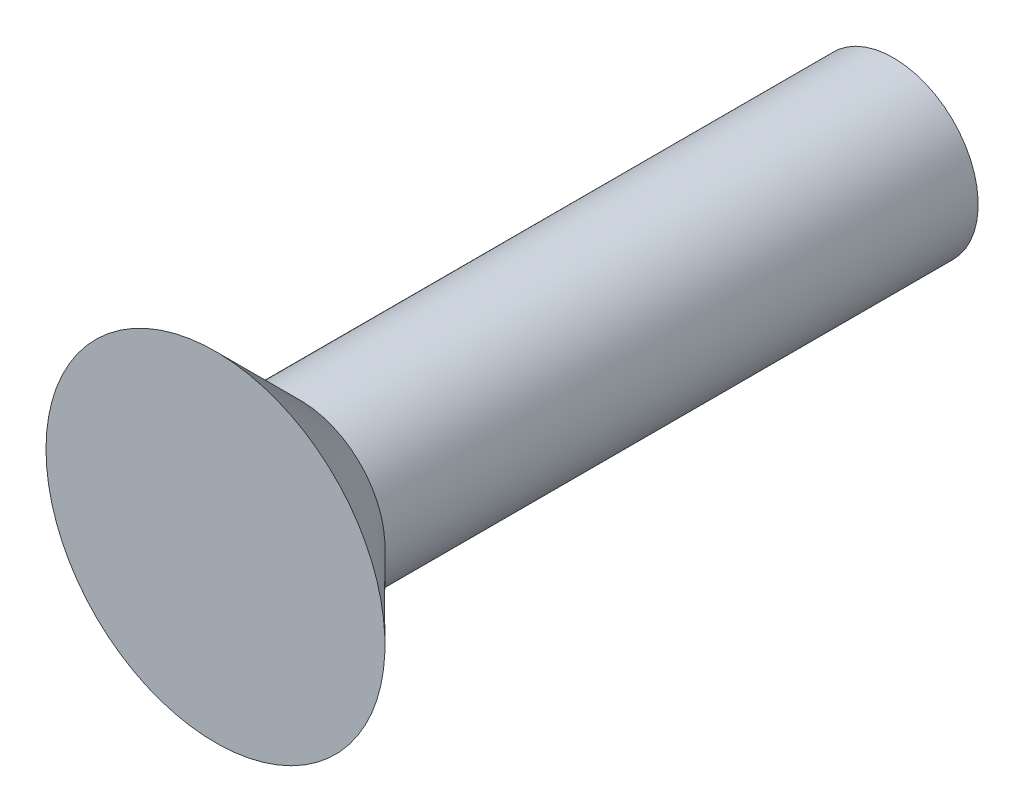
ISO-10303-21;
HEADER;
FILE_DESCRIPTION(('STEP AP214'),'2;1');
FILE_NAME('part.step','',(''),(''),'','','');
FILE_SCHEMA(('AUTOMOTIVE_DESIGN { 1 0 10303 214 1 1 1 1 }'));
ENDSEC;
DATA;
#1=APPLICATION_CONTEXT('core data for automotive mechanical design processes');
#2=APPLICATION_PROTOCOL_DEFINITION('international standard','automotive_design',2000,#1);
#3=PRODUCT_CONTEXT('',#1,'mechanical');
#4=PRODUCT('Part','Part','',(#3));
#5=PRODUCT_RELATED_PRODUCT_CATEGORY('part','',(#4));
#6=PRODUCT_DEFINITION_FORMATION('','',#4);
#7=PRODUCT_DEFINITION_CONTEXT('part definition',#1,'design');
#8=PRODUCT_DEFINITION('design','',#6,#7);
#9=PRODUCT_DEFINITION_SHAPE('','',#8);
#10=(LENGTH_UNIT() NAMED_UNIT(*) SI_UNIT(.MILLI.,.METRE.));
#11=(NAMED_UNIT(*) PLANE_ANGLE_UNIT() SI_UNIT($,.RADIAN.));
#12=(NAMED_UNIT(*) SI_UNIT($,.STERADIAN.) SOLID_ANGLE_UNIT());
#13=UNCERTAINTY_MEASURE_WITH_UNIT(LENGTH_MEASURE(1.E-05),#10,'distance_accuracy_value','');
#14=(GEOMETRIC_REPRESENTATION_CONTEXT(3) GLOBAL_UNCERTAINTY_ASSIGNED_CONTEXT((#13)) GLOBAL_UNIT_ASSIGNED_CONTEXT((#10,
#11,#12)) REPRESENTATION_CONTEXT('',''));
#15=CARTESIAN_POINT('',(0.,0.,0.));
#16=DIRECTION('',(0.,0.,1.));
#17=DIRECTION('',(1.,0.,0.));
#18=AXIS2_PLACEMENT_3D('',#15,#16,#17);
#19=CARTESIAN_POINT('',(0.,0.,-12.));
#20=DIRECTION('',(0.,0.,-1.));
#21=DIRECTION('',(0.,-1.,0.));
#22=AXIS2_PLACEMENT_3D('',#19,#20,#21);
#23=PLANE('',#22);
#24=CARTESIAN_POINT('',(0.,0.,-12.));
#25=DIRECTION('',(0.,0.,-1.));
#26=DIRECTION('',(-1.,0.,0.));
#27=AXIS2_PLACEMENT_3D('',#24,#25,#26);
#28=CIRCLE('',#27,1.5);
#29=CARTESIAN_POINT('',(-1.5,0.,-12.));
#30=VERTEX_POINT('',#29);
#31=EDGE_CURVE('E9',#30,#30,#28,.T.);
#32=ORIENTED_EDGE('',*,*,#31,.T.);
#33=EDGE_LOOP('',(#32));
#34=FACE_BOUND('',#33,.T.);
#35=ADVANCED_FACE('F14',(#34),#23,.T.);
#36=CARTESIAN_POINT('',(0.,0.,0.));
#37=DIRECTION('',(0.,0.,-1.));
#38=DIRECTION('',(0.,-1.,0.));
#39=AXIS2_PLACEMENT_3D('',#36,#37,#38);
#40=PLANE('',#39);
#41=CARTESIAN_POINT('',(0.,0.,0.));
#42=DIRECTION('',(0.,0.,-1.));
#43=DIRECTION('',(-1.,0.,0.));
#44=AXIS2_PLACEMENT_3D('',#41,#42,#43);
#45=CIRCLE('',#44,3.);
#46=CARTESIAN_POINT('',(-3.,0.,0.));
#47=VERTEX_POINT('',#46);
#48=EDGE_CURVE('E40',#47,#47,#45,.T.);
#49=ORIENTED_EDGE('',*,*,#48,.F.);
#50=EDGE_LOOP('',(#49));
#51=FACE_BOUND('',#50,.T.);
#52=ADVANCED_FACE('F16',(#51),#40,.F.);
#53=CARTESIAN_POINT('',(0.,0.,0.));
#54=DIRECTION('',(0.,0.,-1.));
#55=DIRECTION('',(-1.,0.,0.));
#56=AXIS2_PLACEMENT_3D('',#53,#54,#55);
#57=CYLINDRICAL_SURFACE('',#56,1.5);
#58=DIRECTION('',(0.,0.,-1.));
#59=VECTOR('',#58,1.);
#60=CARTESIAN_POINT('',(-1.5,0.,0.));
#61=LINE('',#60,#59);
#62=CARTESIAN_POINT('',(-1.5,0.,-1.5));
#63=VERTEX_POINT('',#62);
#64=EDGE_CURVE('E23',#63,#30,#61,.T.);
#65=ORIENTED_EDGE('',*,*,#64,.T.);
#66=ORIENTED_EDGE('',*,*,#31,.F.);
#67=ORIENTED_EDGE('',*,*,#64,.F.);
#68=CARTESIAN_POINT('',(0.,0.,-1.5));
#69=DIRECTION('',(0.,0.,-1.));
#70=DIRECTION('',(-1.,0.,0.));
#71=AXIS2_PLACEMENT_3D('',#68,#69,#70);
#72=CIRCLE('',#71,1.5);
#73=EDGE_CURVE('E50',#63,#63,#72,.T.);
#74=ORIENTED_EDGE('',*,*,#73,.T.);
#75=EDGE_LOOP('',(#65,#66,#67,#74));
#76=FACE_BOUND('',#75,.T.);
#77=ADVANCED_FACE('F48',(#76),#57,.T.);
#78=CARTESIAN_POINT('',(0.,0.,0.));
#79=DIRECTION('',(0.,0.,1.));
#80=DIRECTION('',(-1.,0.,0.));
#81=AXIS2_PLACEMENT_3D('',#78,#79,#80);
#82=CONICAL_SURFACE('',#81,3.,0.785398163397);
#83=ORIENTED_EDGE('',*,*,#73,.F.);
#84=DIRECTION('',(0.707106781186548,0.,-0.707106781186548));
#85=VECTOR('',#84,1.);
#86=CARTESIAN_POINT('',(-3.,0.,0.));
#87=LINE('',#86,#85);
#88=EDGE_CURVE('E52',#47,#63,#87,.T.);
#89=ORIENTED_EDGE('',*,*,#88,.F.);
#90=ORIENTED_EDGE('',*,*,#48,.T.);
#91=ORIENTED_EDGE('',*,*,#88,.T.);
#92=EDGE_LOOP('',(#83,#89,#90,#91));
#93=FACE_BOUND('',#92,.T.);
#94=ADVANCED_FACE('F53',(#93),#82,.T.);
#95=CLOSED_SHELL('',(#35,#52,#77,#94));
#96=MANIFOLD_SOLID_BREP('B1',#95);
#97=ADVANCED_BREP_SHAPE_REPRESENTATION('',(#18,#96),#14);
#98=SHAPE_DEFINITION_REPRESENTATION(#9,#97);
ENDSEC;
END-ISO-10303-21;
